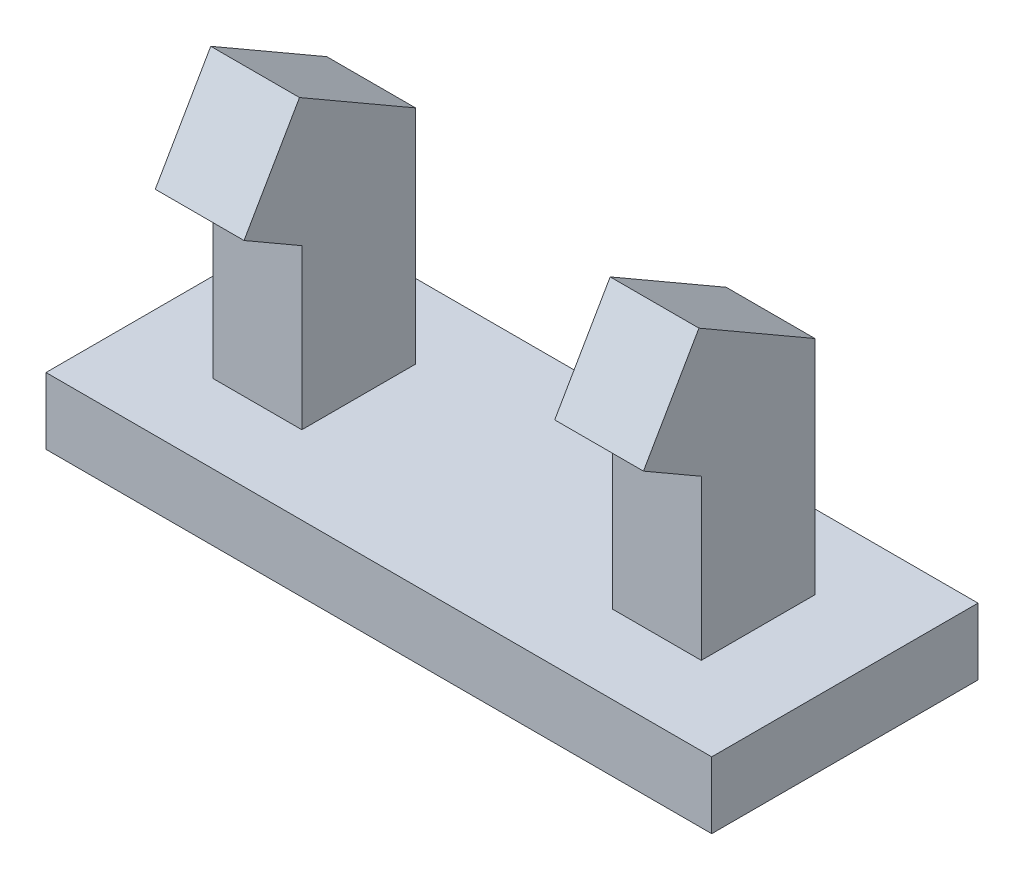
ISO-10303-21;
HEADER;
FILE_DESCRIPTION(('STEP AP214'),'2;1');
FILE_NAME('part.step','',(''),(''),'','','');
FILE_SCHEMA(('AUTOMOTIVE_DESIGN { 1 0 10303 214 1 1 1 1 }'));
ENDSEC;
DATA;
#1=APPLICATION_CONTEXT('core data for automotive mechanical design processes');
#2=APPLICATION_PROTOCOL_DEFINITION('international standard','automotive_design',2000,#1);
#3=PRODUCT_CONTEXT('',#1,'mechanical');
#4=PRODUCT('Part','Part','',(#3));
#5=PRODUCT_RELATED_PRODUCT_CATEGORY('part','',(#4));
#6=PRODUCT_DEFINITION_FORMATION('','',#4);
#7=PRODUCT_DEFINITION_CONTEXT('part definition',#1,'design');
#8=PRODUCT_DEFINITION('design','',#6,#7);
#9=PRODUCT_DEFINITION_SHAPE('','',#8);
#10=(LENGTH_UNIT() NAMED_UNIT(*) SI_UNIT(.MILLI.,.METRE.));
#11=(NAMED_UNIT(*) PLANE_ANGLE_UNIT() SI_UNIT($,.RADIAN.));
#12=(NAMED_UNIT(*) SI_UNIT($,.STERADIAN.) SOLID_ANGLE_UNIT());
#13=UNCERTAINTY_MEASURE_WITH_UNIT(LENGTH_MEASURE(1.E-05),#10,'distance_accuracy_value','');
#14=(GEOMETRIC_REPRESENTATION_CONTEXT(3) GLOBAL_UNCERTAINTY_ASSIGNED_CONTEXT((#13)) GLOBAL_UNIT_ASSIGNED_CONTEXT((#10,
#11,#12)) REPRESENTATION_CONTEXT('',''));
#15=CARTESIAN_POINT('',(0.,0.,0.));
#16=DIRECTION('',(0.,0.,1.));
#17=DIRECTION('',(1.,0.,0.));
#18=AXIS2_PLACEMENT_3D('',#15,#16,#17);
#19=CARTESIAN_POINT('',(75.,15.,-17.650132662709));
#20=DIRECTION('',(0.,0.,1.));
#21=DIRECTION('',(0.,-1.,0.));
#22=AXIS2_PLACEMENT_3D('',#19,#20,#21);
#23=PLANE('',#22);
#24=DIRECTION('',(1.,0.,0.));
#25=VECTOR('',#24,1.);
#26=CARTESIAN_POINT('',(75.,50.9222209829792,-17.6501326627089));
#27=LINE('',#26,#25);
#28=CARTESIAN_POINT('',(110.,50.9222209829792,-17.6501326627089));
#29=VERTEX_POINT('',#28);
#30=CARTESIAN_POINT('',(130.,50.9222209829792,-17.6501326627089));
#31=VERTEX_POINT('',#30);
#32=EDGE_CURVE('E167',#29,#31,#27,.T.);
#33=ORIENTED_EDGE('',*,*,#32,.F.);
#34=DIRECTION('',(0.,-1.,0.));
#35=VECTOR('',#34,1.);
#36=CARTESIAN_POINT('',(110.,50.9222209829792,-17.6501326627089));
#37=LINE('',#36,#35);
#38=CARTESIAN_POINT('',(110.,15.,-17.650132662709));
#39=VERTEX_POINT('',#38);
#40=EDGE_CURVE('E152',#29,#39,#37,.T.);
#41=ORIENTED_EDGE('',*,*,#40,.T.);
#42=DIRECTION('',(1.,0.,0.));
#43=VECTOR('',#42,1.);
#44=CARTESIAN_POINT('',(75.,15.,-17.650132662709));
#45=LINE('',#44,#43);
#46=CARTESIAN_POINT('',(130.,15.,-17.650132662709));
#47=VERTEX_POINT('',#46);
#48=EDGE_CURVE('E175',#39,#47,#45,.T.);
#49=ORIENTED_EDGE('',*,*,#48,.T.);
#50=DIRECTION('',(0.,1.,0.));
#51=VECTOR('',#50,1.);
#52=CARTESIAN_POINT('',(130.,15.,-17.650132662709));
#53=LINE('',#52,#51);
#54=EDGE_CURVE('E174',#47,#31,#53,.T.);
#55=ORIENTED_EDGE('',*,*,#54,.T.);
#56=EDGE_LOOP('',(#33,#41,#49,#55));
#57=FACE_BOUND('',#56,.T.);
#58=ADVANCED_FACE('F39',(#57),#23,.T.);
#59=CARTESIAN_POINT('',(75.,50.9222209829792,-17.6501326627089));
#60=DIRECTION('',(0.,-0.866025403784439,0.5));
#61=DIRECTION('',(0.,-0.5,-0.866025403784439));
#62=AXIS2_PLACEMENT_3D('',#59,#60,#61);
#63=PLANE('',#62);
#64=DIRECTION('',(1.,0.,0.));
#65=VECTOR('',#64,1.);
#66=CARTESIAN_POINT('',(75.,58.4442058252268,-4.62167274217316));
#67=LINE('',#66,#65);
#68=CARTESIAN_POINT('',(110.,58.4442058252268,-4.62167274217316));
#69=VERTEX_POINT('',#68);
#70=CARTESIAN_POINT('',(130.,58.4442058252268,-4.62167274217316));
#71=VERTEX_POINT('',#70);
#72=EDGE_CURVE('E169',#69,#71,#67,.T.);
#73=ORIENTED_EDGE('',*,*,#72,.F.);
#74=DIRECTION('',(0.,-0.499999999999999,-0.866025403784439));
#75=VECTOR('',#74,1.);
#76=CARTESIAN_POINT('',(110.,58.4442058252268,-4.62167274217316));
#77=LINE('',#76,#75);
#78=EDGE_CURVE('E155',#69,#29,#77,.T.);
#79=ORIENTED_EDGE('',*,*,#78,.T.);
#80=ORIENTED_EDGE('',*,*,#32,.T.);
#81=DIRECTION('',(0.,0.499999999999999,0.866025403784439));
#82=VECTOR('',#81,1.);
#83=CARTESIAN_POINT('',(130.,50.9222209829792,-17.6501326627089));
#84=LINE('',#83,#82);
#85=EDGE_CURVE('E287',#31,#71,#84,.T.);
#86=ORIENTED_EDGE('',*,*,#85,.T.);
#87=EDGE_LOOP('',(#73,#79,#80,#86));
#88=FACE_BOUND('',#87,.T.);
#89=ADVANCED_FACE('F165',(#88),#63,.T.);
#90=CARTESIAN_POINT('',(75.,58.4442058252268,-4.62167274217316));
#91=DIRECTION('',(0.,0.5,0.866025403784439));
#92=DIRECTION('',(0.,-0.866025403784439,0.5));
#93=AXIS2_PLACEMENT_3D('',#90,#91,#92);
#94=PLANE('',#93);
#95=DIRECTION('',(1.,0.,0.));
#96=VECTOR('',#95,1.);
#97=CARTESIAN_POINT('',(75.,80.0948409198377,-17.1216727421731));
#98=LINE('',#97,#96);
#99=CARTESIAN_POINT('',(110.,80.0948409198377,-17.1216727421731));
#100=VERTEX_POINT('',#99);
#101=CARTESIAN_POINT('',(130.,80.0948409198377,-17.1216727421731));
#102=VERTEX_POINT('',#101);
#103=EDGE_CURVE('E179',#100,#102,#98,.T.);
#104=ORIENTED_EDGE('',*,*,#103,.F.);
#105=DIRECTION('',(0.,-0.866025403784439,0.5));
#106=VECTOR('',#105,1.);
#107=CARTESIAN_POINT('',(110.,80.0948409198377,-17.1216727421731));
#108=LINE('',#107,#106);
#109=EDGE_CURVE('E170',#100,#69,#108,.T.);
#110=ORIENTED_EDGE('',*,*,#109,.T.);
#111=ORIENTED_EDGE('',*,*,#72,.T.);
#112=DIRECTION('',(0.,0.866025403784439,-0.5));
#113=VECTOR('',#112,1.);
#114=CARTESIAN_POINT('',(130.,58.4442058252268,-4.62167274217316));
#115=LINE('',#114,#113);
#116=EDGE_CURVE('E281',#71,#102,#115,.T.);
#117=ORIENTED_EDGE('',*,*,#116,.T.);
#118=EDGE_LOOP('',(#104,#110,#111,#117));
#119=FACE_BOUND('',#118,.T.);
#120=ADVANCED_FACE('F286',(#119),#94,.T.);
#121=CARTESIAN_POINT('',(75.,80.0948409198377,-17.1216727421731));
#122=DIRECTION('',(0.,0.866025403784439,-0.5));
#123=DIRECTION('',(0.,0.5,0.866025403784439));
#124=AXIS2_PLACEMENT_3D('',#121,#122,#123);
#125=PLANE('',#124);
#126=DIRECTION('',(1.,0.,0.));
#127=VECTOR('',#126,1.);
#128=CARTESIAN_POINT('',(75.,65.,-43.2667041475018));
#129=LINE('',#128,#127);
#130=CARTESIAN_POINT('',(110.,65.,-43.2667041475018));
#131=VERTEX_POINT('',#130);
#132=CARTESIAN_POINT('',(130.,65.,-43.2667041475018));
#133=VERTEX_POINT('',#132);
#134=EDGE_CURVE('E265',#131,#133,#129,.T.);
#135=ORIENTED_EDGE('',*,*,#134,.F.);
#136=DIRECTION('',(0.,0.5,0.866025403784439));
#137=VECTOR('',#136,1.);
#138=CARTESIAN_POINT('',(110.,65.,-43.2667041475018));
#139=LINE('',#138,#137);
#140=EDGE_CURVE('E274',#131,#100,#139,.T.);
#141=ORIENTED_EDGE('',*,*,#140,.T.);
#142=ORIENTED_EDGE('',*,*,#103,.T.);
#143=DIRECTION('',(0.,-0.5,-0.866025403784439));
#144=VECTOR('',#143,1.);
#145=CARTESIAN_POINT('',(130.,80.0948409198377,-17.1216727421731));
#146=LINE('',#145,#144);
#147=EDGE_CURVE('E273',#102,#133,#146,.T.);
#148=ORIENTED_EDGE('',*,*,#147,.T.);
#149=EDGE_LOOP('',(#135,#141,#142,#148));
#150=FACE_BOUND('',#149,.T.);
#151=ADVANCED_FACE('F272',(#150),#125,.T.);
#152=CARTESIAN_POINT('',(75.,65.,-43.2667041475018));
#153=DIRECTION('',(0.,0.,-1.));
#154=DIRECTION('',(0.,1.,0.));
#155=AXIS2_PLACEMENT_3D('',#152,#153,#154);
#156=PLANE('',#155);
#157=DIRECTION('',(1.,0.,0.));
#158=VECTOR('',#157,1.);
#159=CARTESIAN_POINT('',(75.,15.,-43.2667041475018));
#160=LINE('',#159,#158);
#161=CARTESIAN_POINT('',(110.,15.,-43.2667041475018));
#162=VERTEX_POINT('',#161);
#163=CARTESIAN_POINT('',(130.,15.,-43.2667041475018));
#164=VERTEX_POINT('',#163);
#165=EDGE_CURVE('E260',#162,#164,#160,.T.);
#166=ORIENTED_EDGE('',*,*,#165,.F.);
#167=DIRECTION('',(0.,1.,0.));
#168=VECTOR('',#167,1.);
#169=CARTESIAN_POINT('',(110.,15.,-43.2667041475018));
#170=LINE('',#169,#168);
#171=EDGE_CURVE('E300',#162,#131,#170,.T.);
#172=ORIENTED_EDGE('',*,*,#171,.T.);
#173=ORIENTED_EDGE('',*,*,#134,.T.);
#174=DIRECTION('',(0.,-1.,0.));
#175=VECTOR('',#174,1.);
#176=CARTESIAN_POINT('',(130.,65.,-43.2667041475018));
#177=LINE('',#176,#175);
#178=EDGE_CURVE('E284',#133,#164,#177,.T.);
#179=ORIENTED_EDGE('',*,*,#178,.T.);
#180=EDGE_LOOP('',(#166,#172,#173,#179));
#181=FACE_BOUND('',#180,.T.);
#182=ADVANCED_FACE('F298',(#181),#156,.T.);
#183=CARTESIAN_POINT('',(150.,0.,0.));
#184=DIRECTION('',(-1.,0.,0.));
#185=DIRECTION('',(0.,0.,-1.));
#186=AXIS2_PLACEMENT_3D('',#183,#184,#185);
#187=PLANE('',#186);
#188=DIRECTION('',(0.,0.,1.));
#189=VECTOR('',#188,1.);
#190=CARTESIAN_POINT('',(150.,15.,-60.));
#191=LINE('',#190,#189);
#192=CARTESIAN_POINT('',(150.,15.,-60.));
#193=VERTEX_POINT('',#192);
#194=CARTESIAN_POINT('',(150.,15.,0.));
#195=VERTEX_POINT('',#194);
#196=EDGE_CURVE('E255',#193,#195,#191,.T.);
#197=ORIENTED_EDGE('',*,*,#196,.T.);
#198=DIRECTION('',(0.,-1.,0.));
#199=VECTOR('',#198,1.);
#200=CARTESIAN_POINT('',(150.,15.,0.));
#201=LINE('',#200,#199);
#202=CARTESIAN_POINT('',(150.,0.,0.));
#203=VERTEX_POINT('',#202);
#204=EDGE_CURVE('E251',#195,#203,#201,.T.);
#205=ORIENTED_EDGE('',*,*,#204,.T.);
#206=DIRECTION('',(0.,0.,-1.));
#207=VECTOR('',#206,1.);
#208=CARTESIAN_POINT('',(150.,0.,0.));
#209=LINE('',#208,#207);
#210=CARTESIAN_POINT('',(150.,0.,-60.));
#211=VERTEX_POINT('',#210);
#212=EDGE_CURVE('E247',#203,#211,#209,.T.);
#213=ORIENTED_EDGE('',*,*,#212,.T.);
#214=DIRECTION('',(0.,1.,0.));
#215=VECTOR('',#214,1.);
#216=CARTESIAN_POINT('',(150.,0.,-60.));
#217=LINE('',#216,#215);
#218=EDGE_CURVE('E241',#211,#193,#217,.T.);
#219=ORIENTED_EDGE('',*,*,#218,.T.);
#220=EDGE_LOOP('',(#197,#205,#213,#219));
#221=FACE_BOUND('',#220,.T.);
#222=ADVANCED_FACE('F258',(#221),#187,.F.);
#223=CARTESIAN_POINT('',(75.,65.,-43.2667041475018));
#224=DIRECTION('',(0.,0.,1.));
#225=DIRECTION('',(0.,-1.,0.));
#226=AXIS2_PLACEMENT_3D('',#223,#224,#225);
#227=PLANE('',#226);
#228=DIRECTION('',(0.,1.,0.));
#229=VECTOR('',#228,1.);
#230=CARTESIAN_POINT('',(40.,15.,-43.2667041475018));
#231=LINE('',#230,#229);
#232=CARTESIAN_POINT('',(40.,15.,-43.2667041475018));
#233=VERTEX_POINT('',#232);
#234=CARTESIAN_POINT('',(40.,65.,-43.2667041475018));
#235=VERTEX_POINT('',#234);
#236=EDGE_CURVE('E187',#233,#235,#231,.T.);
#237=ORIENTED_EDGE('',*,*,#236,.F.);
#238=DIRECTION('',(-1.,0.,0.));
#239=VECTOR('',#238,1.);
#240=CARTESIAN_POINT('',(75.,15.,-43.2667041475018));
#241=LINE('',#240,#239);
#242=CARTESIAN_POINT('',(20.,15.,-43.2667041475018));
#243=VERTEX_POINT('',#242);
#244=EDGE_CURVE('E233',#233,#243,#241,.T.);
#245=ORIENTED_EDGE('',*,*,#244,.T.);
#246=DIRECTION('',(0.,-1.,0.));
#247=VECTOR('',#246,1.);
#248=CARTESIAN_POINT('',(20.,65.,-43.2667041475018));
#249=LINE('',#248,#247);
#250=CARTESIAN_POINT('',(20.,65.,-43.2667041475018));
#251=VERTEX_POINT('',#250);
#252=EDGE_CURVE('E195',#251,#243,#249,.T.);
#253=ORIENTED_EDGE('',*,*,#252,.F.);
#254=DIRECTION('',(-1.,0.,0.));
#255=VECTOR('',#254,1.);
#256=CARTESIAN_POINT('',(75.,65.,-43.2667041475018));
#257=LINE('',#256,#255);
#258=EDGE_CURVE('E231',#235,#251,#257,.T.);
#259=ORIENTED_EDGE('',*,*,#258,.F.);
#260=EDGE_LOOP('',(#237,#245,#253,#259));
#261=FACE_BOUND('',#260,.T.);
#262=ADVANCED_FACE('F311',(#261),#227,.F.);
#263=CARTESIAN_POINT('',(75.,80.0948409198377,-17.1216727421731));
#264=DIRECTION('',(0.,-0.866025403784439,0.5));
#265=DIRECTION('',(0.,-0.5,-0.866025403784439));
#266=AXIS2_PLACEMENT_3D('',#263,#264,#265);
#267=PLANE('',#266);
#268=DIRECTION('',(0.,0.5,0.866025403784439));
#269=VECTOR('',#268,1.);
#270=CARTESIAN_POINT('',(40.,65.,-43.2667041475018));
#271=LINE('',#270,#269);
#272=CARTESIAN_POINT('',(40.,80.0948409198377,-17.1216727421731));
#273=VERTEX_POINT('',#272);
#274=EDGE_CURVE('E189',#235,#273,#271,.T.);
#275=ORIENTED_EDGE('',*,*,#274,.F.);
#276=ORIENTED_EDGE('',*,*,#258,.T.);
#277=DIRECTION('',(0.,-0.5,-0.866025403784439));
#278=VECTOR('',#277,1.);
#279=CARTESIAN_POINT('',(20.,80.0948409198377,-17.1216727421731));
#280=LINE('',#279,#278);
#281=CARTESIAN_POINT('',(20.,80.0948409198377,-17.1216727421731));
#282=VERTEX_POINT('',#281);
#283=EDGE_CURVE('E210',#282,#251,#280,.T.);
#284=ORIENTED_EDGE('',*,*,#283,.F.);
#285=DIRECTION('',(-1.,0.,0.));
#286=VECTOR('',#285,1.);
#287=CARTESIAN_POINT('',(75.,80.0948409198377,-17.1216727421731));
#288=LINE('',#287,#286);
#289=EDGE_CURVE('E229',#273,#282,#288,.T.);
#290=ORIENTED_EDGE('',*,*,#289,.F.);
#291=EDGE_LOOP('',(#275,#276,#284,#290));
#292=FACE_BOUND('',#291,.T.);
#293=ADVANCED_FACE('F345',(#292),#267,.F.);
#294=CARTESIAN_POINT('',(75.,58.4442058252268,-4.62167274217316));
#295=DIRECTION('',(0.,-0.5,-0.866025403784439));
#296=DIRECTION('',(0.,0.866025403784439,-0.5));
#297=AXIS2_PLACEMENT_3D('',#294,#295,#296);
#298=PLANE('',#297);
#299=DIRECTION('',(0.,-0.866025403784439,0.5));
#300=VECTOR('',#299,1.);
#301=CARTESIAN_POINT('',(40.,80.0948409198377,-17.1216727421731));
#302=LINE('',#301,#300);
#303=CARTESIAN_POINT('',(40.,58.4442058252268,-4.62167274217316));
#304=VERTEX_POINT('',#303);
#305=EDGE_CURVE('E191',#273,#304,#302,.T.);
#306=ORIENTED_EDGE('',*,*,#305,.F.);
#307=ORIENTED_EDGE('',*,*,#289,.T.);
#308=DIRECTION('',(0.,0.866025403784439,-0.5));
#309=VECTOR('',#308,1.);
#310=CARTESIAN_POINT('',(20.,58.4442058252268,-4.62167274217316));
#311=LINE('',#310,#309);
#312=CARTESIAN_POINT('',(20.,58.4442058252268,-4.62167274217316));
#313=VERTEX_POINT('',#312);
#314=EDGE_CURVE('E207',#313,#282,#311,.T.);
#315=ORIENTED_EDGE('',*,*,#314,.F.);
#316=DIRECTION('',(-1.,0.,0.));
#317=VECTOR('',#316,1.);
#318=CARTESIAN_POINT('',(75.,58.4442058252268,-4.62167274217316));
#319=LINE('',#318,#317);
#320=EDGE_CURVE('E227',#304,#313,#319,.T.);
#321=ORIENTED_EDGE('',*,*,#320,.F.);
#322=EDGE_LOOP('',(#306,#307,#315,#321));
#323=FACE_BOUND('',#322,.T.);
#324=ADVANCED_FACE('F341',(#323),#298,.F.);
#325=CARTESIAN_POINT('',(75.,50.9222209829792,-17.6501326627089));
#326=DIRECTION('',(0.,0.866025403784439,-0.5));
#327=DIRECTION('',(0.,0.5,0.866025403784439));
#328=AXIS2_PLACEMENT_3D('',#325,#326,#327);
#329=PLANE('',#328);
#330=DIRECTION('',(0.,-0.499999999999999,-0.866025403784439));
#331=VECTOR('',#330,1.);
#332=CARTESIAN_POINT('',(40.,58.4442058252268,-4.62167274217316));
#333=LINE('',#332,#331);
#334=CARTESIAN_POINT('',(40.,50.9222209829792,-17.6501326627089));
#335=VERTEX_POINT('',#334);
#336=EDGE_CURVE('E193',#304,#335,#333,.T.);
#337=ORIENTED_EDGE('',*,*,#336,.F.);
#338=ORIENTED_EDGE('',*,*,#320,.T.);
#339=DIRECTION('',(0.,0.499999999999999,0.866025403784439));
#340=VECTOR('',#339,1.);
#341=CARTESIAN_POINT('',(20.,50.9222209829792,-17.6501326627089));
#342=LINE('',#341,#340);
#343=CARTESIAN_POINT('',(20.,50.9222209829792,-17.6501326627089));
#344=VERTEX_POINT('',#343);
#345=EDGE_CURVE('E204',#344,#313,#342,.T.);
#346=ORIENTED_EDGE('',*,*,#345,.F.);
#347=DIRECTION('',(-1.,0.,0.));
#348=VECTOR('',#347,1.);
#349=CARTESIAN_POINT('',(75.,50.9222209829792,-17.6501326627089));
#350=LINE('',#349,#348);
#351=EDGE_CURVE('E225',#335,#344,#350,.T.);
#352=ORIENTED_EDGE('',*,*,#351,.F.);
#353=EDGE_LOOP('',(#337,#338,#346,#352));
#354=FACE_BOUND('',#353,.T.);
#355=ADVANCED_FACE('F337',(#354),#329,.F.);
#356=CARTESIAN_POINT('',(75.,15.,-17.650132662709));
#357=DIRECTION('',(0.,0.,-1.));
#358=DIRECTION('',(0.,1.,0.));
#359=AXIS2_PLACEMENT_3D('',#356,#357,#358);
#360=PLANE('',#359);
#361=DIRECTION('',(0.,-1.,0.));
#362=VECTOR('',#361,1.);
#363=CARTESIAN_POINT('',(40.,50.9222209829792,-17.6501326627089));
#364=LINE('',#363,#362);
#365=CARTESIAN_POINT('',(40.,15.,-17.650132662709));
#366=VERTEX_POINT('',#365);
#367=EDGE_CURVE('E177',#335,#366,#364,.T.);
#368=ORIENTED_EDGE('',*,*,#367,.F.);
#369=ORIENTED_EDGE('',*,*,#351,.T.);
#370=DIRECTION('',(0.,1.,0.));
#371=VECTOR('',#370,1.);
#372=CARTESIAN_POINT('',(20.,15.,-17.650132662709));
#373=LINE('',#372,#371);
#374=CARTESIAN_POINT('',(20.,15.,-17.650132662709));
#375=VERTEX_POINT('',#374);
#376=EDGE_CURVE('E201',#375,#344,#373,.T.);
#377=ORIENTED_EDGE('',*,*,#376,.F.);
#378=DIRECTION('',(-1.,0.,0.));
#379=VECTOR('',#378,1.);
#380=CARTESIAN_POINT('',(75.,15.,-17.650132662709));
#381=LINE('',#380,#379);
#382=EDGE_CURVE('E223',#366,#375,#381,.T.);
#383=ORIENTED_EDGE('',*,*,#382,.F.);
#384=EDGE_LOOP('',(#368,#369,#377,#383));
#385=FACE_BOUND('',#384,.T.);
#386=ADVANCED_FACE('F334',(#385),#360,.F.);
#387=CARTESIAN_POINT('',(75.,15.,0.));
#388=DIRECTION('',(0.,0.,-1.));
#389=DIRECTION('',(-1.,0.,0.));
#390=AXIS2_PLACEMENT_3D('',#387,#388,#389);
#391=PLANE('',#390);
#392=DIRECTION('',(0.,-1.,0.));
#393=VECTOR('',#392,1.);
#394=CARTESIAN_POINT('',(0.,15.,0.));
#395=LINE('',#394,#393);
#396=CARTESIAN_POINT('',(0.,15.,0.));
#397=VERTEX_POINT('',#396);
#398=CARTESIAN_POINT('',(0.,0.,0.));
#399=VERTEX_POINT('',#398);
#400=EDGE_CURVE('E213',#397,#399,#395,.T.);
#401=ORIENTED_EDGE('',*,*,#400,.T.);
#402=DIRECTION('',(-1.,0.,0.));
#403=VECTOR('',#402,1.);
#404=CARTESIAN_POINT('',(75.,0.,0.));
#405=LINE('',#404,#403);
#406=EDGE_CURVE('E11',#203,#399,#405,.T.);
#407=ORIENTED_EDGE('',*,*,#406,.F.);
#408=ORIENTED_EDGE('',*,*,#204,.F.);
#409=DIRECTION('',(-1.,0.,0.));
#410=VECTOR('',#409,1.);
#411=CARTESIAN_POINT('',(75.,15.,0.));
#412=LINE('',#411,#410);
#413=EDGE_CURVE('E221',#195,#397,#412,.T.);
#414=ORIENTED_EDGE('',*,*,#413,.T.);
#415=EDGE_LOOP('',(#401,#407,#408,#414));
#416=FACE_BOUND('',#415,.T.);
#417=ADVANCED_FACE('F41',(#416),#391,.F.);
#418=CARTESIAN_POINT('',(75.,0.,0.));
#419=DIRECTION('',(0.,1.,0.));
#420=DIRECTION('',(0.,0.,1.));
#421=AXIS2_PLACEMENT_3D('',#418,#419,#420);
#422=PLANE('',#421);
#423=DIRECTION('',(0.,0.,-1.));
#424=VECTOR('',#423,1.);
#425=CARTESIAN_POINT('',(0.,0.,0.));
#426=LINE('',#425,#424);
#427=CARTESIAN_POINT('',(0.,0.,-60.));
#428=VERTEX_POINT('',#427);
#429=EDGE_CURVE('E216',#399,#428,#426,.T.);
#430=ORIENTED_EDGE('',*,*,#429,.T.);
#431=DIRECTION('',(-1.,0.,0.));
#432=VECTOR('',#431,1.);
#433=CARTESIAN_POINT('',(75.,0.,-60.));
#434=LINE('',#433,#432);
#435=EDGE_CURVE('E47',#211,#428,#434,.T.);
#436=ORIENTED_EDGE('',*,*,#435,.F.);
#437=ORIENTED_EDGE('',*,*,#212,.F.);
#438=ORIENTED_EDGE('',*,*,#406,.T.);
#439=EDGE_LOOP('',(#430,#436,#437,#438));
#440=FACE_BOUND('',#439,.T.);
#441=ADVANCED_FACE('F246',(#440),#422,.F.);
#442=CARTESIAN_POINT('',(75.,0.,-60.));
#443=DIRECTION('',(0.,0.,1.));
#444=DIRECTION('',(1.,0.,0.));
#445=AXIS2_PLACEMENT_3D('',#442,#443,#444);
#446=PLANE('',#445);
#447=DIRECTION('',(0.,1.,0.));
#448=VECTOR('',#447,1.);
#449=CARTESIAN_POINT('',(0.,0.,-60.));
#450=LINE('',#449,#448);
#451=CARTESIAN_POINT('',(0.,15.,-60.));
#452=VERTEX_POINT('',#451);
#453=EDGE_CURVE('E218',#428,#452,#450,.T.);
#454=ORIENTED_EDGE('',*,*,#453,.T.);
#455=DIRECTION('',(-1.,0.,0.));
#456=VECTOR('',#455,1.);
#457=CARTESIAN_POINT('',(75.,15.,-60.));
#458=LINE('',#457,#456);
#459=EDGE_CURVE('E235',#193,#452,#458,.T.);
#460=ORIENTED_EDGE('',*,*,#459,.F.);
#461=ORIENTED_EDGE('',*,*,#218,.F.);
#462=ORIENTED_EDGE('',*,*,#435,.T.);
#463=EDGE_LOOP('',(#454,#460,#461,#462));
#464=FACE_BOUND('',#463,.T.);
#465=ADVANCED_FACE('F239',(#464),#446,.F.);
#466=CARTESIAN_POINT('',(75.,15.,-17.650132662709));
#467=DIRECTION('',(0.,-1.,0.));
#468=DIRECTION('',(0.,0.,-1.));
#469=AXIS2_PLACEMENT_3D('',#466,#467,#468);
#470=PLANE('',#469);
#471=ORIENTED_EDGE('',*,*,#48,.F.);
#472=DIRECTION('',(0.,0.,-1.));
#473=VECTOR('',#472,1.);
#474=CARTESIAN_POINT('',(110.,15.,-17.650132662709));
#475=LINE('',#474,#473);
#476=EDGE_CURVE('E158',#39,#162,#475,.T.);
#477=ORIENTED_EDGE('',*,*,#476,.T.);
#478=ORIENTED_EDGE('',*,*,#165,.T.);
#479=DIRECTION('',(0.,0.,1.));
#480=VECTOR('',#479,1.);
#481=CARTESIAN_POINT('',(130.,15.,-43.2667041475018));
#482=LINE('',#481,#480);
#483=EDGE_CURVE('E293',#164,#47,#482,.T.);
#484=ORIENTED_EDGE('',*,*,#483,.T.);
#485=EDGE_LOOP('',(#471,#477,#478,#484));
#486=FACE_BOUND('',#485,.T.);
#487=ORIENTED_EDGE('',*,*,#413,.F.);
#488=ORIENTED_EDGE('',*,*,#196,.F.);
#489=ORIENTED_EDGE('',*,*,#459,.T.);
#490=DIRECTION('',(0.,0.,1.));
#491=VECTOR('',#490,1.);
#492=CARTESIAN_POINT('',(0.,15.,-17.650132662709));
#493=LINE('',#492,#491);
#494=EDGE_CURVE('E54',#452,#397,#493,.T.);
#495=ORIENTED_EDGE('',*,*,#494,.T.);
#496=EDGE_LOOP('',(#487,#488,#489,#495));
#497=FACE_BOUND('',#496,.T.);
#498=DIRECTION('',(0.,0.,-1.));
#499=VECTOR('',#498,1.);
#500=CARTESIAN_POINT('',(40.,15.,-17.650132662709));
#501=LINE('',#500,#499);
#502=EDGE_CURVE('E185',#366,#233,#501,.T.);
#503=ORIENTED_EDGE('',*,*,#502,.F.);
#504=ORIENTED_EDGE('',*,*,#382,.T.);
#505=DIRECTION('',(0.,0.,1.));
#506=VECTOR('',#505,1.);
#507=CARTESIAN_POINT('',(20.,15.,-43.2667041475018));
#508=LINE('',#507,#506);
#509=EDGE_CURVE('E198',#243,#375,#508,.T.);
#510=ORIENTED_EDGE('',*,*,#509,.F.);
#511=ORIENTED_EDGE('',*,*,#244,.F.);
#512=EDGE_LOOP('',(#503,#504,#510,#511));
#513=FACE_BOUND('',#512,.T.);
#514=ADVANCED_FACE('F253',(#486,#497,#513),#470,.F.);
#515=CARTESIAN_POINT('',(0.,0.,0.));
#516=DIRECTION('',(1.,0.,0.));
#517=DIRECTION('',(0.,0.,-1.));
#518=AXIS2_PLACEMENT_3D('',#515,#516,#517);
#519=PLANE('',#518);
#520=ORIENTED_EDGE('',*,*,#494,.F.);
#521=ORIENTED_EDGE('',*,*,#453,.F.);
#522=ORIENTED_EDGE('',*,*,#429,.F.);
#523=ORIENTED_EDGE('',*,*,#400,.F.);
#524=EDGE_LOOP('',(#520,#521,#522,#523));
#525=FACE_BOUND('',#524,.T.);
#526=ADVANCED_FACE('F245',(#525),#519,.F.);
#527=CARTESIAN_POINT('',(20.,0.,0.));
#528=DIRECTION('',(-1.,0.,0.));
#529=DIRECTION('',(0.,0.,1.));
#530=AXIS2_PLACEMENT_3D('',#527,#528,#529);
#531=PLANE('',#530);
#532=ORIENTED_EDGE('',*,*,#252,.T.);
#533=ORIENTED_EDGE('',*,*,#509,.T.);
#534=ORIENTED_EDGE('',*,*,#376,.T.);
#535=ORIENTED_EDGE('',*,*,#345,.T.);
#536=ORIENTED_EDGE('',*,*,#314,.T.);
#537=ORIENTED_EDGE('',*,*,#283,.T.);
#538=EDGE_LOOP('',(#532,#533,#534,#535,#536,#537));
#539=FACE_BOUND('',#538,.T.);
#540=ADVANCED_FACE('F325',(#539),#531,.T.);
#541=CARTESIAN_POINT('',(40.,0.,0.));
#542=DIRECTION('',(1.,0.,0.));
#543=DIRECTION('',(0.,0.,-1.));
#544=AXIS2_PLACEMENT_3D('',#541,#542,#543);
#545=PLANE('',#544);
#546=ORIENTED_EDGE('',*,*,#367,.T.);
#547=ORIENTED_EDGE('',*,*,#502,.T.);
#548=ORIENTED_EDGE('',*,*,#236,.T.);
#549=ORIENTED_EDGE('',*,*,#274,.T.);
#550=ORIENTED_EDGE('',*,*,#305,.T.);
#551=ORIENTED_EDGE('',*,*,#336,.T.);
#552=EDGE_LOOP('',(#546,#547,#548,#549,#550,#551));
#553=FACE_BOUND('',#552,.T.);
#554=ADVANCED_FACE('F323',(#553),#545,.T.);
#555=CARTESIAN_POINT('',(130.,0.,0.));
#556=DIRECTION('',(1.,0.,0.));
#557=DIRECTION('',(0.,0.,1.));
#558=AXIS2_PLACEMENT_3D('',#555,#556,#557);
#559=PLANE('',#558);
#560=ORIENTED_EDGE('',*,*,#178,.F.);
#561=ORIENTED_EDGE('',*,*,#147,.F.);
#562=ORIENTED_EDGE('',*,*,#116,.F.);
#563=ORIENTED_EDGE('',*,*,#85,.F.);
#564=ORIENTED_EDGE('',*,*,#54,.F.);
#565=ORIENTED_EDGE('',*,*,#483,.F.);
#566=EDGE_LOOP('',(#560,#561,#562,#563,#564,#565));
#567=FACE_BOUND('',#566,.T.);
#568=ADVANCED_FACE('F280',(#567),#559,.T.);
#569=CARTESIAN_POINT('',(110.,0.,0.));
#570=DIRECTION('',(-1.,0.,0.));
#571=DIRECTION('',(0.,0.,-1.));
#572=AXIS2_PLACEMENT_3D('',#569,#570,#571);
#573=PLANE('',#572);
#574=ORIENTED_EDGE('',*,*,#40,.F.);
#575=ORIENTED_EDGE('',*,*,#78,.F.);
#576=ORIENTED_EDGE('',*,*,#109,.F.);
#577=ORIENTED_EDGE('',*,*,#140,.F.);
#578=ORIENTED_EDGE('',*,*,#171,.F.);
#579=ORIENTED_EDGE('',*,*,#476,.F.);
#580=EDGE_LOOP('',(#574,#575,#576,#577,#578,#579));
#581=FACE_BOUND('',#580,.T.);
#582=ADVANCED_FACE('F154',(#581),#573,.T.);
#583=CLOSED_SHELL('',(#58,#89,#120,#151,#182,#222,#262,#293,#324,#355,#386,#417,#441,#465,#514,
#526,#540,#554,#568,#582));
#584=MANIFOLD_SOLID_BREP('B2',#583);
#585=ADVANCED_BREP_SHAPE_REPRESENTATION('',(#18,#584),#14);
#586=SHAPE_DEFINITION_REPRESENTATION(#9,#585);
ENDSEC;
END-ISO-10303-21;
